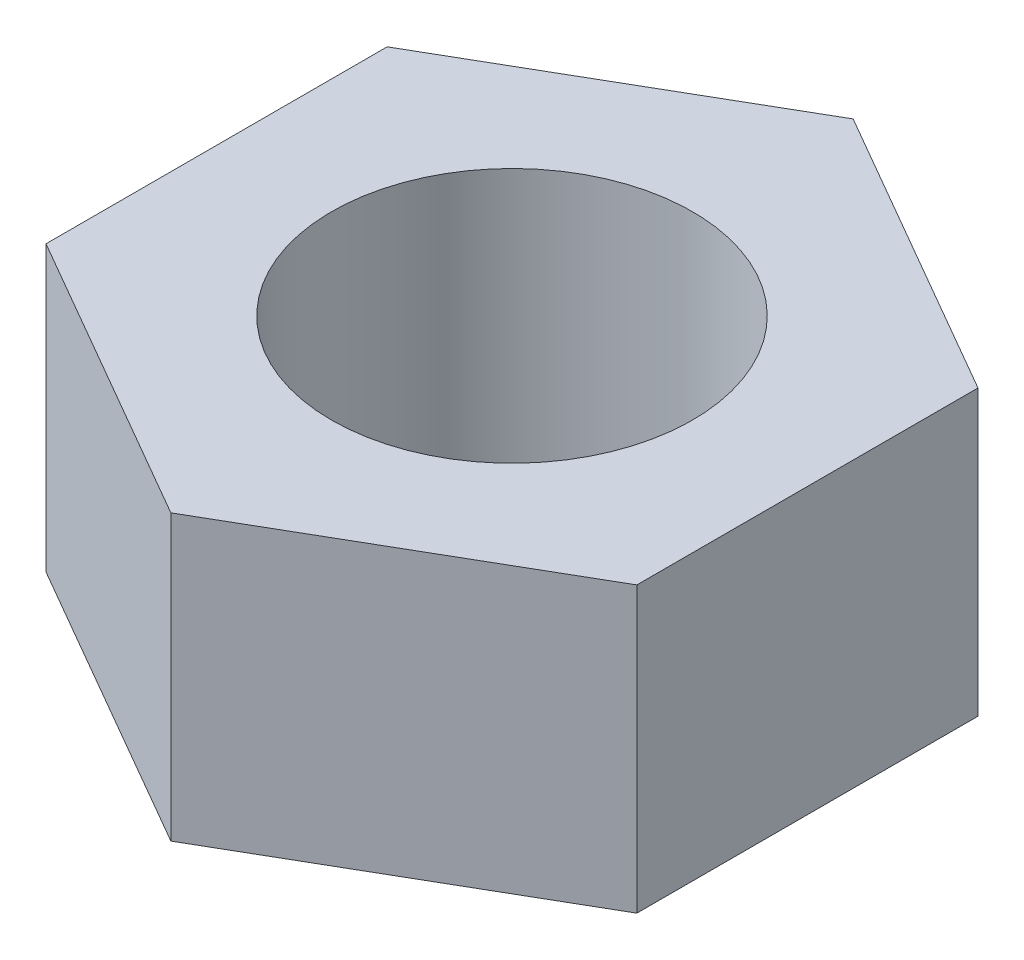
ISO-10303-21;
HEADER;
FILE_DESCRIPTION(('STEP AP214'),'2;1');
FILE_NAME('part.step','',(''),(''),'','','');
FILE_SCHEMA(('AUTOMOTIVE_DESIGN { 1 0 10303 214 1 1 1 1 }'));
ENDSEC;
DATA;
#1=APPLICATION_CONTEXT('core data for automotive mechanical design processes');
#2=APPLICATION_PROTOCOL_DEFINITION('international standard','automotive_design',2000,#1);
#3=PRODUCT_CONTEXT('',#1,'mechanical');
#4=PRODUCT('Part','Part','',(#3));
#5=PRODUCT_RELATED_PRODUCT_CATEGORY('part','',(#4));
#6=PRODUCT_DEFINITION_FORMATION('','',#4);
#7=PRODUCT_DEFINITION_CONTEXT('part definition',#1,'design');
#8=PRODUCT_DEFINITION('design','',#6,#7);
#9=PRODUCT_DEFINITION_SHAPE('','',#8);
#10=(LENGTH_UNIT() NAMED_UNIT(*) SI_UNIT(.MILLI.,.METRE.));
#11=(NAMED_UNIT(*) PLANE_ANGLE_UNIT() SI_UNIT($,.RADIAN.));
#12=(NAMED_UNIT(*) SI_UNIT($,.STERADIAN.) SOLID_ANGLE_UNIT());
#13=UNCERTAINTY_MEASURE_WITH_UNIT(LENGTH_MEASURE(1.E-05),#10,'distance_accuracy_value','');
#14=(GEOMETRIC_REPRESENTATION_CONTEXT(3) GLOBAL_UNCERTAINTY_ASSIGNED_CONTEXT((#13)) GLOBAL_UNIT_ASSIGNED_CONTEXT((#10,
#11,#12)) REPRESENTATION_CONTEXT('',''));
#15=CARTESIAN_POINT('',(0.,0.,0.));
#16=DIRECTION('',(0.,0.,1.));
#17=DIRECTION('',(1.,0.,0.));
#18=AXIS2_PLACEMENT_3D('',#15,#16,#17);
#19=CARTESIAN_POINT('',(0.,5.,0.));
#20=DIRECTION('',(0.,1.,0.));
#21=DIRECTION('',(0.,0.,1.));
#22=AXIS2_PLACEMENT_3D('',#19,#20,#21);
#23=PLANE('',#22);
#24=DIRECTION('',(-0.866025403784442,0.,-0.499999999999995));
#25=VECTOR('',#24,1.);
#26=CARTESIAN_POINT('',(5.19615242270659,5.,-3.00000000000005));
#27=LINE('',#26,#25);
#28=CARTESIAN_POINT('',(5.19615242270659,5.,-3.00000000000005));
#29=VERTEX_POINT('',#28);
#30=CARTESIAN_POINT('',(0.,5.,-5.99999999999999));
#31=VERTEX_POINT('',#30);
#32=EDGE_CURVE('E146',#29,#31,#27,.T.);
#33=ORIENTED_EDGE('',*,*,#32,.T.);
#34=DIRECTION('',(-0.866025403784438,0.,0.500000000000001));
#35=VECTOR('',#34,1.);
#36=CARTESIAN_POINT('',(0.,5.,-5.99999999999999));
#37=LINE('',#36,#35);
#38=CARTESIAN_POINT('',(-5.19615242270663,5.,-2.99999999999998));
#39=VERTEX_POINT('',#38);
#40=EDGE_CURVE('E94',#31,#39,#37,.T.);
#41=ORIENTED_EDGE('',*,*,#40,.T.);
#42=DIRECTION('',(0.,0.,1.));
#43=VECTOR('',#42,1.);
#44=CARTESIAN_POINT('',(-5.19615242270663,5.,-2.99999999999998));
#45=LINE('',#44,#43);
#46=CARTESIAN_POINT('',(-5.19615242270661,5.,3.00000000000002));
#47=VERTEX_POINT('',#46);
#48=EDGE_CURVE('E107',#39,#47,#45,.T.);
#49=ORIENTED_EDGE('',*,*,#48,.T.);
#50=DIRECTION('',(0.866025403784441,0.,0.499999999999995));
#51=VECTOR('',#50,1.);
#52=CARTESIAN_POINT('',(-5.19615242270661,5.,3.00000000000002));
#53=LINE('',#52,#51);
#54=CARTESIAN_POINT('',(0.,5.,5.99999999999999));
#55=VERTEX_POINT('',#54);
#56=EDGE_CURVE('E101',#47,#55,#53,.T.);
#57=ORIENTED_EDGE('',*,*,#56,.T.);
#58=DIRECTION('',(0.866025403784434,0.,-0.500000000000007));
#59=VECTOR('',#58,1.);
#60=CARTESIAN_POINT('',(0.,5.,5.99999999999999));
#61=LINE('',#60,#59);
#62=CARTESIAN_POINT('',(5.19615242270665,5.,2.99999999999995));
#63=VERTEX_POINT('',#62);
#64=EDGE_CURVE('E105',#55,#63,#61,.T.);
#65=ORIENTED_EDGE('',*,*,#64,.T.);
#66=DIRECTION('',(0.,0.,-1.));
#67=VECTOR('',#66,1.);
#68=CARTESIAN_POINT('',(5.19615242270665,5.,2.99999999999995));
#69=LINE('',#68,#67);
#70=EDGE_CURVE('E57',#63,#29,#69,.T.);
#71=ORIENTED_EDGE('',*,*,#70,.T.);
#72=EDGE_LOOP('',(#33,#41,#49,#57,#65,#71));
#73=FACE_BOUND('',#72,.T.);
#74=CARTESIAN_POINT('',(0.,5.,0.));
#75=DIRECTION('',(0.,1.,0.));
#76=DIRECTION('',(0.,0.,1.));
#77=AXIS2_PLACEMENT_3D('',#74,#75,#76);
#78=CIRCLE('',#77,3.175);
#79=CARTESIAN_POINT('',(0.,5.,3.175));
#80=VERTEX_POINT('',#79);
#81=EDGE_CURVE('E134',#80,#80,#78,.T.);
#82=ORIENTED_EDGE('',*,*,#81,.F.);
#83=EDGE_LOOP('',(#82));
#84=FACE_BOUND('',#83,.T.);
#85=ADVANCED_FACE('F39',(#73,#84),#23,.T.);
#86=CARTESIAN_POINT('',(0.,0.,0.));
#87=DIRECTION('',(0.,1.,0.));
#88=DIRECTION('',(0.,0.,1.));
#89=AXIS2_PLACEMENT_3D('',#86,#87,#88);
#90=PLANE('',#89);
#91=DIRECTION('',(-0.866025403784442,0.,-0.499999999999995));
#92=VECTOR('',#91,1.);
#93=CARTESIAN_POINT('',(5.19615242270659,0.,-3.00000000000005));
#94=LINE('',#93,#92);
#95=CARTESIAN_POINT('',(5.19615242270659,0.,-3.00000000000005));
#96=VERTEX_POINT('',#95);
#97=CARTESIAN_POINT('',(0.,0.,-5.99999999999999));
#98=VERTEX_POINT('',#97);
#99=EDGE_CURVE('E129',#96,#98,#94,.T.);
#100=ORIENTED_EDGE('',*,*,#99,.F.);
#101=DIRECTION('',(0.,0.,-1.));
#102=VECTOR('',#101,1.);
#103=CARTESIAN_POINT('',(5.19615242270665,0.,2.99999999999995));
#104=LINE('',#103,#102);
#105=CARTESIAN_POINT('',(5.19615242270665,0.,2.99999999999995));
#106=VERTEX_POINT('',#105);
#107=EDGE_CURVE('E86',#106,#96,#104,.T.);
#108=ORIENTED_EDGE('',*,*,#107,.F.);
#109=DIRECTION('',(0.866025403784434,0.,-0.500000000000007));
#110=VECTOR('',#109,1.);
#111=CARTESIAN_POINT('',(0.,0.,5.99999999999999));
#112=LINE('',#111,#110);
#113=CARTESIAN_POINT('',(0.,0.,5.99999999999999));
#114=VERTEX_POINT('',#113);
#115=EDGE_CURVE('E80',#114,#106,#112,.T.);
#116=ORIENTED_EDGE('',*,*,#115,.F.);
#117=DIRECTION('',(0.866025403784441,0.,0.499999999999995));
#118=VECTOR('',#117,1.);
#119=CARTESIAN_POINT('',(-5.19615242270661,0.,3.00000000000002));
#120=LINE('',#119,#118);
#121=CARTESIAN_POINT('',(-5.19615242270661,0.,3.00000000000002));
#122=VERTEX_POINT('',#121);
#123=EDGE_CURVE('E116',#122,#114,#120,.T.);
#124=ORIENTED_EDGE('',*,*,#123,.F.);
#125=DIRECTION('',(0.,0.,1.));
#126=VECTOR('',#125,1.);
#127=CARTESIAN_POINT('',(-5.19615242270663,0.,-2.99999999999998));
#128=LINE('',#127,#126);
#129=CARTESIAN_POINT('',(-5.19615242270663,0.,-2.99999999999998));
#130=VERTEX_POINT('',#129);
#131=EDGE_CURVE('E137',#130,#122,#128,.T.);
#132=ORIENTED_EDGE('',*,*,#131,.F.);
#133=DIRECTION('',(-0.866025403784438,0.,0.500000000000001));
#134=VECTOR('',#133,1.);
#135=CARTESIAN_POINT('',(0.,0.,-5.99999999999999));
#136=LINE('',#135,#134);
#137=EDGE_CURVE('E133',#98,#130,#136,.T.);
#138=ORIENTED_EDGE('',*,*,#137,.F.);
#139=EDGE_LOOP('',(#100,#108,#116,#124,#132,#138));
#140=FACE_BOUND('',#139,.T.);
#141=CARTESIAN_POINT('',(0.,0.,0.));
#142=DIRECTION('',(0.,1.,0.));
#143=DIRECTION('',(0.,0.,1.));
#144=AXIS2_PLACEMENT_3D('',#141,#142,#143);
#145=CIRCLE('',#144,3.175);
#146=CARTESIAN_POINT('',(0.,0.,3.175));
#147=VERTEX_POINT('',#146);
#148=EDGE_CURVE('E243',#147,#147,#145,.T.);
#149=ORIENTED_EDGE('',*,*,#148,.T.);
#150=EDGE_LOOP('',(#149));
#151=FACE_BOUND('',#150,.T.);
#152=ADVANCED_FACE('F159',(#140,#151),#90,.F.);
#153=CARTESIAN_POINT('',(5.19615242270659,5.,-3.00000000000005));
#154=DIRECTION('',(-0.499999999999995,0.,0.866025403784442));
#155=DIRECTION('',(0.866025403784442,0.,0.499999999999995));
#156=AXIS2_PLACEMENT_3D('',#153,#154,#155);
#157=PLANE('',#156);
#158=ORIENTED_EDGE('',*,*,#99,.T.);
#159=DIRECTION('',(0.,-1.,0.));
#160=VECTOR('',#159,1.);
#161=CARTESIAN_POINT('',(0.,5.,-5.99999999999999));
#162=LINE('',#161,#160);
#163=EDGE_CURVE('E11',#31,#98,#162,.T.);
#164=ORIENTED_EDGE('',*,*,#163,.F.);
#165=ORIENTED_EDGE('',*,*,#32,.F.);
#166=DIRECTION('',(0.,-1.,0.));
#167=VECTOR('',#166,1.);
#168=CARTESIAN_POINT('',(5.19615242270659,5.,-3.00000000000005));
#169=LINE('',#168,#167);
#170=EDGE_CURVE('E125',#29,#96,#169,.T.);
#171=ORIENTED_EDGE('',*,*,#170,.T.);
#172=EDGE_LOOP('',(#158,#164,#165,#171));
#173=FACE_BOUND('',#172,.T.);
#174=ADVANCED_FACE('F41',(#173),#157,.F.);
#175=CARTESIAN_POINT('',(0.,5.,-5.99999999999999));
#176=DIRECTION('',(0.500000000000001,0.,0.866025403784438));
#177=DIRECTION('',(0.866025403784438,0.,-0.500000000000001));
#178=AXIS2_PLACEMENT_3D('',#175,#176,#177);
#179=PLANE('',#178);
#180=ORIENTED_EDGE('',*,*,#137,.T.);
#181=DIRECTION('',(0.,-1.,0.));
#182=VECTOR('',#181,1.);
#183=CARTESIAN_POINT('',(-5.19615242270663,5.,-2.99999999999998));
#184=LINE('',#183,#182);
#185=EDGE_CURVE('E49',#39,#130,#184,.T.);
#186=ORIENTED_EDGE('',*,*,#185,.F.);
#187=ORIENTED_EDGE('',*,*,#40,.F.);
#188=ORIENTED_EDGE('',*,*,#163,.T.);
#189=EDGE_LOOP('',(#180,#186,#187,#188));
#190=FACE_BOUND('',#189,.T.);
#191=ADVANCED_FACE('F184',(#190),#179,.F.);
#192=CARTESIAN_POINT('',(-5.19615242270663,5.,-2.99999999999998));
#193=DIRECTION('',(1.,0.,0.));
#194=DIRECTION('',(0.,0.,-1.));
#195=AXIS2_PLACEMENT_3D('',#192,#193,#194);
#196=PLANE('',#195);
#197=ORIENTED_EDGE('',*,*,#131,.T.);
#198=DIRECTION('',(0.,-1.,0.));
#199=VECTOR('',#198,1.);
#200=CARTESIAN_POINT('',(-5.19615242270661,5.,3.00000000000002));
#201=LINE('',#200,#199);
#202=EDGE_CURVE('E118',#47,#122,#201,.T.);
#203=ORIENTED_EDGE('',*,*,#202,.F.);
#204=ORIENTED_EDGE('',*,*,#48,.F.);
#205=ORIENTED_EDGE('',*,*,#185,.T.);
#206=EDGE_LOOP('',(#197,#203,#204,#205));
#207=FACE_BOUND('',#206,.T.);
#208=ADVANCED_FACE('F156',(#207),#196,.F.);
#209=CARTESIAN_POINT('',(-5.19615242270661,5.,3.00000000000002));
#210=DIRECTION('',(0.499999999999995,0.,-0.866025403784441));
#211=DIRECTION('',(-0.866025403784441,0.,-0.499999999999995));
#212=AXIS2_PLACEMENT_3D('',#209,#210,#211);
#213=PLANE('',#212);
#214=ORIENTED_EDGE('',*,*,#123,.T.);
#215=DIRECTION('',(0.,-1.,0.));
#216=VECTOR('',#215,1.);
#217=CARTESIAN_POINT('',(0.,5.,5.99999999999999));
#218=LINE('',#217,#216);
#219=EDGE_CURVE('E113',#55,#114,#218,.T.);
#220=ORIENTED_EDGE('',*,*,#219,.F.);
#221=ORIENTED_EDGE('',*,*,#56,.F.);
#222=ORIENTED_EDGE('',*,*,#202,.T.);
#223=EDGE_LOOP('',(#214,#220,#221,#222));
#224=FACE_BOUND('',#223,.T.);
#225=ADVANCED_FACE('F114',(#224),#213,.F.);
#226=CARTESIAN_POINT('',(0.,5.,5.99999999999999));
#227=DIRECTION('',(-0.500000000000007,0.,-0.866025403784434));
#228=DIRECTION('',(-0.866025403784435,0.,0.500000000000007));
#229=AXIS2_PLACEMENT_3D('',#226,#227,#228);
#230=PLANE('',#229);
#231=ORIENTED_EDGE('',*,*,#115,.T.);
#232=DIRECTION('',(0.,-1.,0.));
#233=VECTOR('',#232,1.);
#234=CARTESIAN_POINT('',(5.19615242270665,5.,2.99999999999995));
#235=LINE('',#234,#233);
#236=EDGE_CURVE('E119',#63,#106,#235,.T.);
#237=ORIENTED_EDGE('',*,*,#236,.F.);
#238=ORIENTED_EDGE('',*,*,#64,.F.);
#239=ORIENTED_EDGE('',*,*,#219,.T.);
#240=EDGE_LOOP('',(#231,#237,#238,#239));
#241=FACE_BOUND('',#240,.T.);
#242=ADVANCED_FACE('F121',(#241),#230,.F.);
#243=CARTESIAN_POINT('',(5.19615242270665,5.,2.99999999999995));
#244=DIRECTION('',(-1.,0.,0.));
#245=DIRECTION('',(0.,0.,1.));
#246=AXIS2_PLACEMENT_3D('',#243,#244,#245);
#247=PLANE('',#246);
#248=ORIENTED_EDGE('',*,*,#107,.T.);
#249=ORIENTED_EDGE('',*,*,#170,.F.);
#250=ORIENTED_EDGE('',*,*,#70,.F.);
#251=ORIENTED_EDGE('',*,*,#236,.T.);
#252=EDGE_LOOP('',(#248,#249,#250,#251));
#253=FACE_BOUND('',#252,.T.);
#254=ADVANCED_FACE('F164',(#253),#247,.F.);
#255=CARTESIAN_POINT('',(0.,5.,0.));
#256=DIRECTION('',(0.,-1.,0.));
#257=DIRECTION('',(0.,0.,-1.));
#258=AXIS2_PLACEMENT_3D('',#255,#256,#257);
#259=CYLINDRICAL_SURFACE('',#258,3.175);
#260=ORIENTED_EDGE('',*,*,#81,.T.);
#261=EDGE_LOOP('',(#260));
#262=FACE_BOUND('',#261,.T.);
#263=ORIENTED_EDGE('',*,*,#148,.F.);
#264=EDGE_LOOP('',(#263));
#265=FACE_BOUND('',#264,.T.);
#266=ADVANCED_FACE('F166',(#262,#265),#259,.F.);
#267=CLOSED_SHELL('',(#85,#152,#174,#191,#208,#225,#242,#254,#266));
#268=MANIFOLD_SOLID_BREP('B2',#267);
#269=ADVANCED_BREP_SHAPE_REPRESENTATION('',(#18,#268),#14);
#270=SHAPE_DEFINITION_REPRESENTATION(#9,#269);
ENDSEC;
END-ISO-10303-21;
